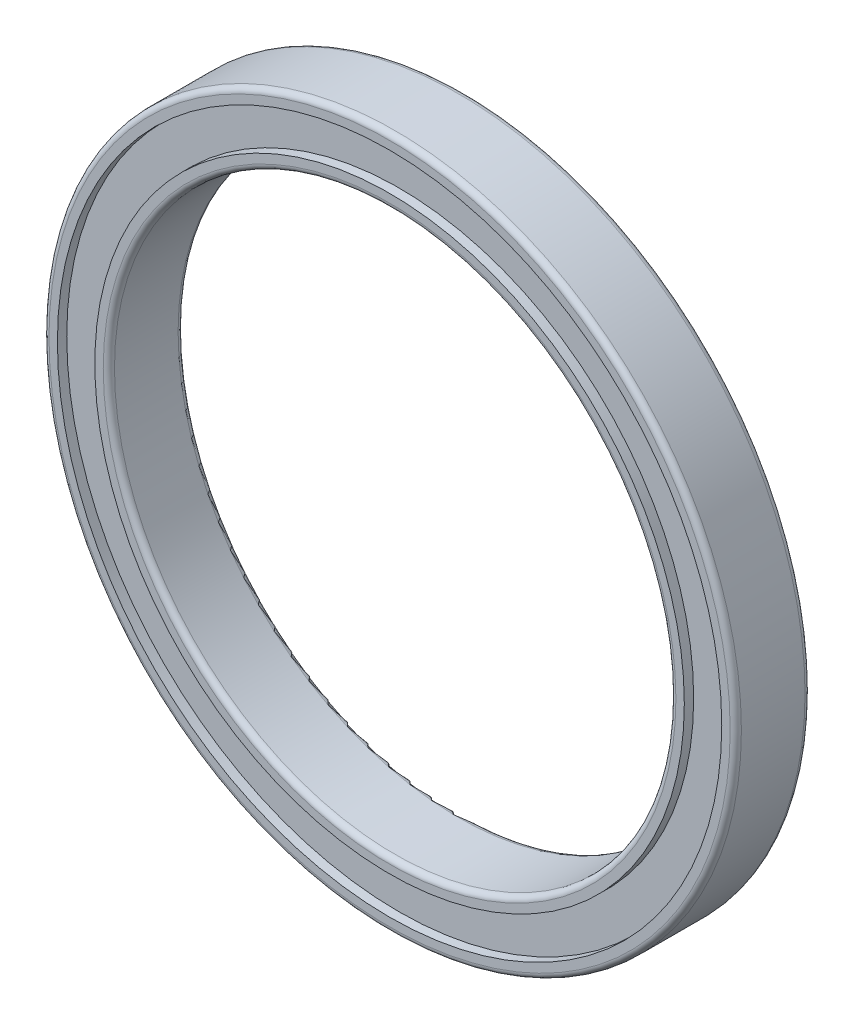
ISO-10303-21;
HEADER;
FILE_DESCRIPTION(('STEP AP214'),'2;1');
FILE_NAME('part.step','',(''),(''),'','','');
FILE_SCHEMA(('AUTOMOTIVE_DESIGN { 1 0 10303 214 1 1 1 1 }'));
ENDSEC;
DATA;
#1=APPLICATION_CONTEXT('core data for automotive mechanical design processes');
#2=APPLICATION_PROTOCOL_DEFINITION('international standard','automotive_design',2000,#1);
#3=PRODUCT_CONTEXT('',#1,'mechanical');
#4=PRODUCT('Part','Part','',(#3));
#5=PRODUCT_RELATED_PRODUCT_CATEGORY('part','',(#4));
#6=PRODUCT_DEFINITION_FORMATION('','',#4);
#7=PRODUCT_DEFINITION_CONTEXT('part definition',#1,'design');
#8=PRODUCT_DEFINITION('design','',#6,#7);
#9=PRODUCT_DEFINITION_SHAPE('','',#8);
#10=(LENGTH_UNIT() NAMED_UNIT(*) SI_UNIT(.MILLI.,.METRE.));
#11=(NAMED_UNIT(*) PLANE_ANGLE_UNIT() SI_UNIT($,.RADIAN.));
#12=(NAMED_UNIT(*) SI_UNIT($,.STERADIAN.) SOLID_ANGLE_UNIT());
#13=UNCERTAINTY_MEASURE_WITH_UNIT(LENGTH_MEASURE(1.E-05),#10,'distance_accuracy_value','');
#14=(GEOMETRIC_REPRESENTATION_CONTEXT(3) GLOBAL_UNCERTAINTY_ASSIGNED_CONTEXT((#13)) GLOBAL_UNIT_ASSIGNED_CONTEXT((#10,
#11,#12)) REPRESENTATION_CONTEXT('',''));
#15=CARTESIAN_POINT('',(0.,0.,0.));
#16=DIRECTION('',(0.,0.,1.));
#17=DIRECTION('',(1.,0.,0.));
#18=AXIS2_PLACEMENT_3D('',#15,#16,#17);
#19=CARTESIAN_POINT('',(0.,0.,0.5));
#20=DIRECTION('',(0.,0.,-1.));
#21=DIRECTION('',(-1.,0.,0.));
#22=AXIS2_PLACEMENT_3D('',#19,#20,#21);
#23=PLANE('',#22);
#24=CARTESIAN_POINT('',(0.,0.,0.5));
#25=DIRECTION('',(0.,0.,-1.));
#26=DIRECTION('',(-1.,0.,0.));
#27=AXIS2_PLACEMENT_3D('',#24,#25,#26);
#28=CIRCLE('',#27,15.75);
#29=CARTESIAN_POINT('',(-15.75,0.,0.5));
#30=VERTEX_POINT('',#29);
#31=EDGE_CURVE('E264',#30,#30,#28,.T.);
#32=ORIENTED_EDGE('',*,*,#31,.F.);
#33=EDGE_LOOP('',(#32));
#34=FACE_BOUND('',#33,.T.);
#35=CARTESIAN_POINT('',(0.,0.,0.5));
#36=DIRECTION('',(0.,0.,-1.));
#37=DIRECTION('',(-1.,0.,0.));
#38=AXIS2_PLACEMENT_3D('',#35,#36,#37);
#39=CIRCLE('',#38,17.75);
#40=CARTESIAN_POINT('',(-17.75,0.,0.5));
#41=VERTEX_POINT('',#40);
#42=EDGE_CURVE('E261',#41,#41,#39,.T.);
#43=ORIENTED_EDGE('',*,*,#42,.T.);
#44=EDGE_LOOP('',(#43));
#45=FACE_BOUND('',#44,.T.);
#46=ADVANCED_FACE('F17',(#34,#45),#23,.T.);
#47=CARTESIAN_POINT('',(0.,0.,0.5));
#48=DIRECTION('',(0.,0.,-1.));
#49=DIRECTION('',(-1.,0.,0.));
#50=AXIS2_PLACEMENT_3D('',#47,#48,#49);
#51=CYLINDRICAL_SURFACE('',#50,17.75);
#52=CARTESIAN_POINT('',(0.,0.,0.));
#53=DIRECTION('',(0.,0.,-1.));
#54=DIRECTION('',(-1.,0.,0.));
#55=AXIS2_PLACEMENT_3D('',#52,#53,#54);
#56=CIRCLE('',#55,17.75);
#57=CARTESIAN_POINT('',(-17.75,0.,0.));
#58=VERTEX_POINT('',#57);
#59=EDGE_CURVE('E267',#58,#58,#56,.T.);
#60=ORIENTED_EDGE('',*,*,#59,.T.);
#61=EDGE_LOOP('',(#60));
#62=FACE_BOUND('',#61,.T.);
#63=ORIENTED_EDGE('',*,*,#42,.F.);
#64=EDGE_LOOP('',(#63));
#65=FACE_BOUND('',#64,.T.);
#66=ADVANCED_FACE('F393',(#62,#65),#51,.F.);
#67=CARTESIAN_POINT('',(0.,0.,0.5));
#68=DIRECTION('',(0.,0.,-1.));
#69=DIRECTION('',(-1.,0.,0.));
#70=AXIS2_PLACEMENT_3D('',#67,#68,#69);
#71=CYLINDRICAL_SURFACE('',#70,15.75);
#72=CARTESIAN_POINT('',(0.,0.,0.));
#73=DIRECTION('',(0.,0.,-1.));
#74=DIRECTION('',(-1.,0.,0.));
#75=AXIS2_PLACEMENT_3D('',#72,#73,#74);
#76=CIRCLE('',#75,15.75);
#77=CARTESIAN_POINT('',(-15.75,0.,0.));
#78=VERTEX_POINT('',#77);
#79=EDGE_CURVE('E64',#78,#78,#76,.F.);
#80=ORIENTED_EDGE('',*,*,#79,.T.);
#81=EDGE_LOOP('',(#80));
#82=FACE_BOUND('',#81,.T.);
#83=ORIENTED_EDGE('',*,*,#31,.T.);
#84=EDGE_LOOP('',(#83));
#85=FACE_BOUND('',#84,.T.);
#86=ADVANCED_FACE('F384',(#82,#85),#71,.T.);
#87=CARTESIAN_POINT('',(0.,0.,0.));
#88=DIRECTION('',(0.,0.,1.));
#89=DIRECTION('',(1.,0.,0.));
#90=AXIS2_PLACEMENT_3D('',#87,#88,#89);
#91=PLANE('',#90);
#92=ORIENTED_EDGE('',*,*,#59,.F.);
#93=EDGE_LOOP('',(#92));
#94=FACE_BOUND('',#93,.T.);
#95=CARTESIAN_POINT('',(0.,0.,0.));
#96=DIRECTION('',(0.,0.,1.));
#97=DIRECTION('',(-1.,0.,0.));
#98=AXIS2_PLACEMENT_3D('',#95,#96,#97);
#99=CIRCLE('',#98,18.2);
#100=CARTESIAN_POINT('',(-18.2,0.,0.));
#101=VERTEX_POINT('',#100);
#102=CARTESIAN_POINT('',(18.2,0.,0.));
#103=VERTEX_POINT('',#102);
#104=EDGE_CURVE('E57',#101,#103,#99,.T.);
#105=ORIENTED_EDGE('',*,*,#104,.F.);
#106=CARTESIAN_POINT('',(0.,0.,0.));
#107=DIRECTION('',(0.,0.,1.));
#108=DIRECTION('',(1.,0.,0.));
#109=AXIS2_PLACEMENT_3D('',#106,#107,#108);
#110=CIRCLE('',#109,18.2);
#111=EDGE_CURVE('E62',#103,#101,#110,.T.);
#112=ORIENTED_EDGE('',*,*,#111,.F.);
#113=EDGE_LOOP('',(#105,#112));
#114=FACE_BOUND('',#113,.T.);
#115=ADVANCED_FACE('F61',(#94,#114),#91,.F.);
#116=CARTESIAN_POINT('',(0.,0.,0.));
#117=DIRECTION('',(0.,0.,1.));
#118=DIRECTION('',(1.,0.,0.));
#119=AXIS2_PLACEMENT_3D('',#116,#117,#118);
#120=PLANE('',#119);
#121=CARTESIAN_POINT('',(0.,0.,0.));
#122=DIRECTION('',(0.,0.,-1.));
#123=DIRECTION('',(-1.,0.,0.));
#124=AXIS2_PLACEMENT_3D('',#121,#122,#123);
#125=CIRCLE('',#124,15.3);
#126=CARTESIAN_POINT('',(-15.3,0.,0.));
#127=VERTEX_POINT('',#126);
#128=CARTESIAN_POINT('',(15.3,0.,0.));
#129=VERTEX_POINT('',#128);
#130=EDGE_CURVE('E69',#127,#129,#125,.T.);
#131=ORIENTED_EDGE('',*,*,#130,.F.);
#132=CARTESIAN_POINT('',(0.,0.,0.));
#133=DIRECTION('',(0.,0.,-1.));
#134=DIRECTION('',(1.,0.,0.));
#135=AXIS2_PLACEMENT_3D('',#132,#133,#134);
#136=CIRCLE('',#135,15.3);
#137=EDGE_CURVE('E113',#129,#127,#136,.T.);
#138=ORIENTED_EDGE('',*,*,#137,.F.);
#139=EDGE_LOOP('',(#131,#138));
#140=FACE_BOUND('',#139,.T.);
#141=ORIENTED_EDGE('',*,*,#79,.F.);
#142=EDGE_LOOP('',(#141));
#143=FACE_BOUND('',#142,.T.);
#144=ADVANCED_FACE('F89',(#140,#143),#120,.F.);
#145=CARTESIAN_POINT('',(0.,0.,0.3));
#146=DIRECTION('',(0.,0.,1.));
#147=DIRECTION('',(1.,0.,0.));
#148=AXIS2_PLACEMENT_3D('',#145,#146,#147);
#149=TOROIDAL_SURFACE('',#148,18.2,0.3);
#150=CARTESIAN_POINT('',(0.,0.,0.3));
#151=DIRECTION('',(0.,0.,-1.));
#152=DIRECTION('',(-1.,0.,0.));
#153=AXIS2_PLACEMENT_3D('',#150,#151,#152);
#154=CIRCLE('',#153,18.5);
#155=CARTESIAN_POINT('',(-18.5,0.,0.3));
#156=VERTEX_POINT('',#155);
#157=EDGE_CURVE('E99',#156,#156,#154,.F.);
#158=ORIENTED_EDGE('',*,*,#157,.F.);
#159=EDGE_LOOP('',(#158));
#160=FACE_BOUND('',#159,.T.);
#161=ORIENTED_EDGE('',*,*,#111,.T.);
#162=ORIENTED_EDGE('',*,*,#104,.T.);
#163=EDGE_LOOP('',(#161,#162));
#164=FACE_BOUND('',#163,.T.);
#165=ADVANCED_FACE('F68',(#160,#164),#149,.T.);
#166=CARTESIAN_POINT('',(0.,0.,0.3));
#167=DIRECTION('',(0.,0.,1.));
#168=DIRECTION('',(1.,0.,0.));
#169=AXIS2_PLACEMENT_3D('',#166,#167,#168);
#170=TOROIDAL_SURFACE('',#169,15.3,0.3);
#171=ORIENTED_EDGE('',*,*,#130,.T.);
#172=ORIENTED_EDGE('',*,*,#137,.T.);
#173=EDGE_LOOP('',(#171,#172));
#174=FACE_BOUND('',#173,.T.);
#175=CARTESIAN_POINT('',(0.,0.,0.3));
#176=DIRECTION('',(0.,0.,-1.));
#177=DIRECTION('',(-1.,0.,0.));
#178=AXIS2_PLACEMENT_3D('',#175,#176,#177);
#179=CIRCLE('',#178,15.);
#180=CARTESIAN_POINT('',(-15.,0.,0.3));
#181=VERTEX_POINT('',#180);
#182=EDGE_CURVE('E133',#181,#181,#179,.F.);
#183=ORIENTED_EDGE('',*,*,#182,.T.);
#184=EDGE_LOOP('',(#183));
#185=FACE_BOUND('',#184,.T.);
#186=ADVANCED_FACE('F88',(#174,#185),#170,.T.);
#187=CARTESIAN_POINT('',(0.,0.,4.));
#188=DIRECTION('',(0.,0.,-1.));
#189=DIRECTION('',(-1.,0.,0.));
#190=AXIS2_PLACEMENT_3D('',#187,#188,#189);
#191=CYLINDRICAL_SURFACE('',#190,18.5);
#192=ORIENTED_EDGE('',*,*,#157,.T.);
#193=EDGE_LOOP('',(#192));
#194=FACE_BOUND('',#193,.T.);
#195=CARTESIAN_POINT('',(0.,0.,3.7));
#196=DIRECTION('',(0.,0.,1.));
#197=DIRECTION('',(1.,0.,0.));
#198=AXIS2_PLACEMENT_3D('',#195,#196,#197);
#199=CIRCLE('',#198,18.5);
#200=CARTESIAN_POINT('',(18.5,0.,3.7));
#201=VERTEX_POINT('',#200);
#202=EDGE_CURVE('E137',#201,#201,#199,.T.);
#203=ORIENTED_EDGE('',*,*,#202,.F.);
#204=EDGE_LOOP('',(#203));
#205=FACE_BOUND('',#204,.T.);
#206=ADVANCED_FACE('F348',(#194,#205),#191,.T.);
#207=CARTESIAN_POINT('',(0.,0.,4.));
#208=DIRECTION('',(0.,0.,-1.));
#209=DIRECTION('',(-1.,0.,0.));
#210=AXIS2_PLACEMENT_3D('',#207,#208,#209);
#211=CYLINDRICAL_SURFACE('',#210,15.);
#212=ORIENTED_EDGE('',*,*,#182,.F.);
#213=EDGE_LOOP('',(#212));
#214=FACE_BOUND('',#213,.T.);
#215=CARTESIAN_POINT('',(0.,0.,3.7));
#216=DIRECTION('',(0.,0.,1.));
#217=DIRECTION('',(1.,0.,0.));
#218=AXIS2_PLACEMENT_3D('',#215,#216,#217);
#219=CIRCLE('',#218,15.);
#220=CARTESIAN_POINT('',(15.,0.,3.7));
#221=VERTEX_POINT('',#220);
#222=EDGE_CURVE('E141',#221,#221,#219,.F.);
#223=ORIENTED_EDGE('',*,*,#222,.F.);
#224=EDGE_LOOP('',(#223));
#225=FACE_BOUND('',#224,.T.);
#226=ADVANCED_FACE('F164',(#214,#225),#211,.F.);
#227=CARTESIAN_POINT('',(0.,0.,3.7));
#228=DIRECTION('',(0.,0.,1.));
#229=DIRECTION('',(1.,0.,0.));
#230=AXIS2_PLACEMENT_3D('',#227,#228,#229);
#231=TOROIDAL_SURFACE('',#230,18.2,0.3);
#232=CARTESIAN_POINT('',(0.,0.,4.));
#233=DIRECTION('',(0.,0.,-1.));
#234=DIRECTION('',(1.,0.,0.));
#235=AXIS2_PLACEMENT_3D('',#232,#233,#234);
#236=CIRCLE('',#235,18.2);
#237=CARTESIAN_POINT('',(-18.2,0.,4.));
#238=VERTEX_POINT('',#237);
#239=CARTESIAN_POINT('',(18.2,0.,4.));
#240=VERTEX_POINT('',#239);
#241=EDGE_CURVE('E147',#238,#240,#236,.F.);
#242=ORIENTED_EDGE('',*,*,#241,.F.);
#243=CARTESIAN_POINT('',(0.,0.,4.));
#244=DIRECTION('',(0.,0.,-1.));
#245=DIRECTION('',(-1.,0.,0.));
#246=AXIS2_PLACEMENT_3D('',#243,#244,#245);
#247=CIRCLE('',#246,18.2);
#248=EDGE_CURVE('E232',#240,#238,#247,.F.);
#249=ORIENTED_EDGE('',*,*,#248,.F.);
#250=EDGE_LOOP('',(#242,#249));
#251=FACE_BOUND('',#250,.T.);
#252=ORIENTED_EDGE('',*,*,#202,.T.);
#253=EDGE_LOOP('',(#252));
#254=FACE_BOUND('',#253,.T.);
#255=ADVANCED_FACE('F153',(#251,#254),#231,.T.);
#256=CARTESIAN_POINT('',(0.,0.,3.7));
#257=DIRECTION('',(0.,0.,1.));
#258=DIRECTION('',(1.,0.,0.));
#259=AXIS2_PLACEMENT_3D('',#256,#257,#258);
#260=TOROIDAL_SURFACE('',#259,15.3,0.3);
#261=ORIENTED_EDGE('',*,*,#222,.T.);
#262=EDGE_LOOP('',(#261));
#263=FACE_BOUND('',#262,.T.);
#264=CARTESIAN_POINT('',(0.,0.,4.));
#265=DIRECTION('',(0.,0.,1.));
#266=DIRECTION('',(-1.,0.,0.));
#267=AXIS2_PLACEMENT_3D('',#264,#265,#266);
#268=CIRCLE('',#267,15.3);
#269=CARTESIAN_POINT('',(15.3,0.,4.));
#270=VERTEX_POINT('',#269);
#271=CARTESIAN_POINT('',(-15.3,0.,4.));
#272=VERTEX_POINT('',#271);
#273=EDGE_CURVE('E36',#270,#272,#268,.F.);
#274=ORIENTED_EDGE('',*,*,#273,.F.);
#275=CARTESIAN_POINT('',(0.,0.,4.));
#276=DIRECTION('',(0.,0.,1.));
#277=DIRECTION('',(1.,0.,0.));
#278=AXIS2_PLACEMENT_3D('',#275,#276,#277);
#279=CIRCLE('',#278,15.3);
#280=EDGE_CURVE('E229',#272,#270,#279,.F.);
#281=ORIENTED_EDGE('',*,*,#280,.F.);
#282=EDGE_LOOP('',(#274,#281));
#283=FACE_BOUND('',#282,.T.);
#284=ADVANCED_FACE('F163',(#263,#283),#260,.T.);
#285=CARTESIAN_POINT('',(0.,0.,4.));
#286=DIRECTION('',(0.,0.,1.));
#287=DIRECTION('',(1.,0.,0.));
#288=AXIS2_PLACEMENT_3D('',#285,#286,#287);
#289=PLANE('',#288);
#290=CARTESIAN_POINT('',(0.,0.,4.));
#291=DIRECTION('',(0.,0.,1.));
#292=DIRECTION('',(1.,0.,0.));
#293=AXIS2_PLACEMENT_3D('',#290,#291,#292);
#294=CIRCLE('',#293,17.75);
#295=CARTESIAN_POINT('',(17.75,0.,4.));
#296=VERTEX_POINT('',#295);
#297=EDGE_CURVE('E233',#296,#296,#294,.F.);
#298=ORIENTED_EDGE('',*,*,#297,.T.);
#299=EDGE_LOOP('',(#298));
#300=FACE_BOUND('',#299,.T.);
#301=ORIENTED_EDGE('',*,*,#241,.T.);
#302=ORIENTED_EDGE('',*,*,#248,.T.);
#303=EDGE_LOOP('',(#301,#302));
#304=FACE_BOUND('',#303,.T.);
#305=ADVANCED_FACE('F186',(#300,#304),#289,.T.);
#306=CARTESIAN_POINT('',(0.,0.,4.));
#307=DIRECTION('',(0.,0.,1.));
#308=DIRECTION('',(1.,0.,0.));
#309=AXIS2_PLACEMENT_3D('',#306,#307,#308);
#310=PLANE('',#309);
#311=ORIENTED_EDGE('',*,*,#280,.T.);
#312=ORIENTED_EDGE('',*,*,#273,.T.);
#313=EDGE_LOOP('',(#311,#312));
#314=FACE_BOUND('',#313,.T.);
#315=CARTESIAN_POINT('',(0.,0.,4.));
#316=DIRECTION('',(0.,0.,1.));
#317=DIRECTION('',(1.,0.,0.));
#318=AXIS2_PLACEMENT_3D('',#315,#316,#317);
#319=CIRCLE('',#318,15.75);
#320=CARTESIAN_POINT('',(15.75,0.,4.));
#321=VERTEX_POINT('',#320);
#322=EDGE_CURVE('E274',#321,#321,#319,.F.);
#323=ORIENTED_EDGE('',*,*,#322,.F.);
#324=EDGE_LOOP('',(#323));
#325=FACE_BOUND('',#324,.T.);
#326=ADVANCED_FACE('F195',(#314,#325),#310,.T.);
#327=CARTESIAN_POINT('',(0.,0.,3.5));
#328=DIRECTION('',(0.,0.,1.));
#329=DIRECTION('',(1.,0.,0.));
#330=AXIS2_PLACEMENT_3D('',#327,#328,#329);
#331=CYLINDRICAL_SURFACE('',#330,17.75);
#332=ORIENTED_EDGE('',*,*,#297,.F.);
#333=EDGE_LOOP('',(#332));
#334=FACE_BOUND('',#333,.T.);
#335=CARTESIAN_POINT('',(0.,0.,3.5));
#336=DIRECTION('',(0.,0.,1.));
#337=DIRECTION('',(1.,0.,0.));
#338=AXIS2_PLACEMENT_3D('',#335,#336,#337);
#339=CIRCLE('',#338,17.75);
#340=CARTESIAN_POINT('',(17.75,0.,3.5));
#341=VERTEX_POINT('',#340);
#342=EDGE_CURVE('E28',#341,#341,#339,.T.);
#343=ORIENTED_EDGE('',*,*,#342,.F.);
#344=EDGE_LOOP('',(#343));
#345=FACE_BOUND('',#344,.T.);
#346=ADVANCED_FACE('F281',(#334,#345),#331,.F.);
#347=CARTESIAN_POINT('',(0.,0.,3.5));
#348=DIRECTION('',(0.,0.,1.));
#349=DIRECTION('',(1.,0.,0.));
#350=AXIS2_PLACEMENT_3D('',#347,#348,#349);
#351=CYLINDRICAL_SURFACE('',#350,15.75);
#352=ORIENTED_EDGE('',*,*,#322,.T.);
#353=EDGE_LOOP('',(#352));
#354=FACE_BOUND('',#353,.T.);
#355=CARTESIAN_POINT('',(0.,0.,3.5));
#356=DIRECTION('',(0.,0.,1.));
#357=DIRECTION('',(1.,0.,0.));
#358=AXIS2_PLACEMENT_3D('',#355,#356,#357);
#359=CIRCLE('',#358,15.75);
#360=CARTESIAN_POINT('',(15.75,0.,3.5));
#361=VERTEX_POINT('',#360);
#362=EDGE_CURVE('E11',#361,#361,#359,.F.);
#363=ORIENTED_EDGE('',*,*,#362,.F.);
#364=EDGE_LOOP('',(#363));
#365=FACE_BOUND('',#364,.T.);
#366=ADVANCED_FACE('F283',(#354,#365),#351,.T.);
#367=CARTESIAN_POINT('',(0.,0.,3.5));
#368=DIRECTION('',(0.,0.,1.));
#369=DIRECTION('',(1.,0.,0.));
#370=AXIS2_PLACEMENT_3D('',#367,#368,#369);
#371=PLANE('',#370);
#372=ORIENTED_EDGE('',*,*,#362,.T.);
#373=EDGE_LOOP('',(#372));
#374=FACE_BOUND('',#373,.T.);
#375=ORIENTED_EDGE('',*,*,#342,.T.);
#376=EDGE_LOOP('',(#375));
#377=FACE_BOUND('',#376,.T.);
#378=ADVANCED_FACE('F279',(#374,#377),#371,.T.);
#379=CLOSED_SHELL('',(#46,#66,#86,#115,#144,#165,#186,#206,#226,#255,#284,#305,#326,#346,#366,#378));
#380=MANIFOLD_SOLID_BREP('B1',#379);
#381=ADVANCED_BREP_SHAPE_REPRESENTATION('',(#18,#380),#14);
#382=SHAPE_DEFINITION_REPRESENTATION(#9,#381);
ENDSEC;
END-ISO-10303-21;
